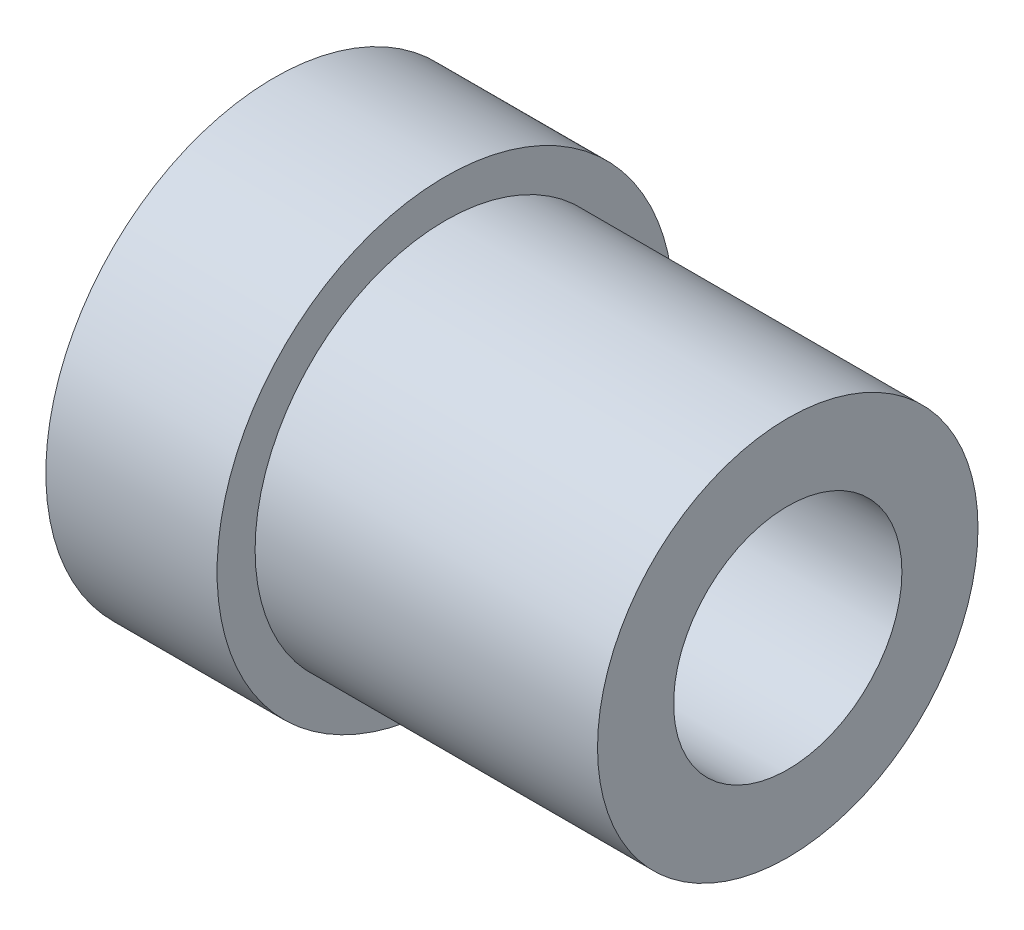
ISO-10303-21;
HEADER;
FILE_DESCRIPTION(('STEP AP214'),'2;1');
FILE_NAME('part.step','',(''),(''),'','','');
FILE_SCHEMA(('AUTOMOTIVE_DESIGN { 1 0 10303 214 1 1 1 1 }'));
ENDSEC;
DATA;
#1=APPLICATION_CONTEXT('core data for automotive mechanical design processes');
#2=APPLICATION_PROTOCOL_DEFINITION('international standard','automotive_design',2000,#1);
#3=PRODUCT_CONTEXT('',#1,'mechanical');
#4=PRODUCT('Part','Part','',(#3));
#5=PRODUCT_RELATED_PRODUCT_CATEGORY('part','',(#4));
#6=PRODUCT_DEFINITION_FORMATION('','',#4);
#7=PRODUCT_DEFINITION_CONTEXT('part definition',#1,'design');
#8=PRODUCT_DEFINITION('design','',#6,#7);
#9=PRODUCT_DEFINITION_SHAPE('','',#8);
#10=(LENGTH_UNIT() NAMED_UNIT(*) SI_UNIT(.MILLI.,.METRE.));
#11=(NAMED_UNIT(*) PLANE_ANGLE_UNIT() SI_UNIT($,.RADIAN.));
#12=(NAMED_UNIT(*) SI_UNIT($,.STERADIAN.) SOLID_ANGLE_UNIT());
#13=UNCERTAINTY_MEASURE_WITH_UNIT(LENGTH_MEASURE(1.E-05),#10,'distance_accuracy_value','');
#14=(GEOMETRIC_REPRESENTATION_CONTEXT(3) GLOBAL_UNCERTAINTY_ASSIGNED_CONTEXT((#13)) GLOBAL_UNIT_ASSIGNED_CONTEXT((#10,
#11,#12)) REPRESENTATION_CONTEXT('',''));
#15=CARTESIAN_POINT('',(0.,0.,0.));
#16=DIRECTION('',(0.,0.,1.));
#17=DIRECTION('',(1.,0.,0.));
#18=AXIS2_PLACEMENT_3D('',#15,#16,#17);
#19=CARTESIAN_POINT('',(4.5,0.,0.));
#20=DIRECTION('',(1.,0.,0.));
#21=DIRECTION('',(0.,0.,-1.));
#22=AXIS2_PLACEMENT_3D('',#19,#20,#21);
#23=PLANE('',#22);
#24=CARTESIAN_POINT('',(4.5,0.,0.));
#25=DIRECTION('',(1.,0.,0.));
#26=DIRECTION('',(0.,0.,-1.));
#27=AXIS2_PLACEMENT_3D('',#24,#25,#26);
#28=CIRCLE('',#27,6.);
#29=CARTESIAN_POINT('',(4.5,0.,-6.));
#30=VERTEX_POINT('',#29);
#31=EDGE_CURVE('E10',#30,#30,#28,.T.);
#32=ORIENTED_EDGE('',*,*,#31,.T.);
#33=EDGE_LOOP('',(#32));
#34=FACE_BOUND('',#33,.T.);
#35=CARTESIAN_POINT('',(4.5,0.,0.));
#36=DIRECTION('',(1.,0.,0.));
#37=DIRECTION('',(0.,0.,-1.));
#38=AXIS2_PLACEMENT_3D('',#35,#36,#37);
#39=CIRCLE('',#38,5.);
#40=CARTESIAN_POINT('',(4.5,0.,-5.));
#41=VERTEX_POINT('',#40);
#42=EDGE_CURVE('E46',#41,#41,#39,.T.);
#43=ORIENTED_EDGE('',*,*,#42,.F.);
#44=EDGE_LOOP('',(#43));
#45=FACE_BOUND('',#44,.T.);
#46=ADVANCED_FACE('F30',(#34,#45),#23,.T.);
#47=CARTESIAN_POINT('',(0.,0.,0.));
#48=DIRECTION('',(1.,0.,0.));
#49=DIRECTION('',(0.,0.,-1.));
#50=AXIS2_PLACEMENT_3D('',#47,#48,#49);
#51=PLANE('',#50);
#52=CARTESIAN_POINT('',(0.,0.,0.));
#53=DIRECTION('',(1.,0.,0.));
#54=DIRECTION('',(0.,0.,-1.));
#55=AXIS2_PLACEMENT_3D('',#52,#53,#54);
#56=CIRCLE('',#55,6.);
#57=CARTESIAN_POINT('',(0.,0.,-6.));
#58=VERTEX_POINT('',#57);
#59=EDGE_CURVE('E34',#58,#58,#56,.T.);
#60=ORIENTED_EDGE('',*,*,#59,.F.);
#61=EDGE_LOOP('',(#60));
#62=FACE_BOUND('',#61,.T.);
#63=CARTESIAN_POINT('',(0.,0.,0.));
#64=DIRECTION('',(1.,0.,0.));
#65=DIRECTION('',(0.,0.,-1.));
#66=AXIS2_PLACEMENT_3D('',#63,#64,#65);
#67=CIRCLE('',#66,3.);
#68=CARTESIAN_POINT('',(0.,0.,-3.));
#69=VERTEX_POINT('',#68);
#70=EDGE_CURVE('E41',#69,#69,#67,.T.);
#71=ORIENTED_EDGE('',*,*,#70,.T.);
#72=EDGE_LOOP('',(#71));
#73=FACE_BOUND('',#72,.T.);
#74=ADVANCED_FACE('F71',(#62,#73),#51,.F.);
#75=CARTESIAN_POINT('',(4.5,0.,0.));
#76=DIRECTION('',(-1.,0.,0.));
#77=DIRECTION('',(0.,0.,1.));
#78=AXIS2_PLACEMENT_3D('',#75,#76,#77);
#79=CYLINDRICAL_SURFACE('',#78,6.);
#80=ORIENTED_EDGE('',*,*,#31,.F.);
#81=EDGE_LOOP('',(#80));
#82=FACE_BOUND('',#81,.T.);
#83=ORIENTED_EDGE('',*,*,#59,.T.);
#84=EDGE_LOOP('',(#83));
#85=FACE_BOUND('',#84,.T.);
#86=ADVANCED_FACE('F32',(#82,#85),#79,.T.);
#87=CARTESIAN_POINT('',(4.5,0.,0.));
#88=DIRECTION('',(-1.,0.,0.));
#89=DIRECTION('',(0.,0.,1.));
#90=AXIS2_PLACEMENT_3D('',#87,#88,#89);
#91=CYLINDRICAL_SURFACE('',#90,3.);
#92=ORIENTED_EDGE('',*,*,#70,.F.);
#93=EDGE_LOOP('',(#92));
#94=FACE_BOUND('',#93,.T.);
#95=CARTESIAN_POINT('',(13.5,0.,0.));
#96=DIRECTION('',(1.,0.,0.));
#97=DIRECTION('',(0.,0.,-1.));
#98=AXIS2_PLACEMENT_3D('',#95,#96,#97);
#99=CIRCLE('',#98,3.);
#100=CARTESIAN_POINT('',(13.5,0.,-3.));
#101=VERTEX_POINT('',#100);
#102=EDGE_CURVE('E49',#101,#101,#99,.T.);
#103=ORIENTED_EDGE('',*,*,#102,.T.);
#104=EDGE_LOOP('',(#103));
#105=FACE_BOUND('',#104,.T.);
#106=ADVANCED_FACE('F55',(#94,#105),#91,.F.);
#107=CARTESIAN_POINT('',(13.5,0.,0.));
#108=DIRECTION('',(1.,0.,0.));
#109=DIRECTION('',(0.,0.,-1.));
#110=AXIS2_PLACEMENT_3D('',#107,#108,#109);
#111=PLANE('',#110);
#112=CARTESIAN_POINT('',(13.5,0.,0.));
#113=DIRECTION('',(1.,0.,0.));
#114=DIRECTION('',(0.,0.,-1.));
#115=AXIS2_PLACEMENT_3D('',#112,#113,#114);
#116=CIRCLE('',#115,5.);
#117=CARTESIAN_POINT('',(13.5,0.,-5.));
#118=VERTEX_POINT('',#117);
#119=EDGE_CURVE('E45',#118,#118,#116,.T.);
#120=ORIENTED_EDGE('',*,*,#119,.T.);
#121=EDGE_LOOP('',(#120));
#122=FACE_BOUND('',#121,.T.);
#123=ORIENTED_EDGE('',*,*,#102,.F.);
#124=EDGE_LOOP('',(#123));
#125=FACE_BOUND('',#124,.T.);
#126=ADVANCED_FACE('F57',(#122,#125),#111,.T.);
#127=CARTESIAN_POINT('',(13.5,0.,0.));
#128=DIRECTION('',(-1.,0.,0.));
#129=DIRECTION('',(0.,0.,1.));
#130=AXIS2_PLACEMENT_3D('',#127,#128,#129);
#131=CYLINDRICAL_SURFACE('',#130,5.);
#132=ORIENTED_EDGE('',*,*,#119,.F.);
#133=EDGE_LOOP('',(#132));
#134=FACE_BOUND('',#133,.T.);
#135=ORIENTED_EDGE('',*,*,#42,.T.);
#136=EDGE_LOOP('',(#135));
#137=FACE_BOUND('',#136,.T.);
#138=ADVANCED_FACE('F59',(#134,#137),#131,.T.);
#139=CLOSED_SHELL('',(#46,#74,#86,#106,#126,#138));
#140=MANIFOLD_SOLID_BREP('B2',#139);
#141=ADVANCED_BREP_SHAPE_REPRESENTATION('',(#18,#140),#14);
#142=SHAPE_DEFINITION_REPRESENTATION(#9,#141);
ENDSEC;
END-ISO-10303-21;
